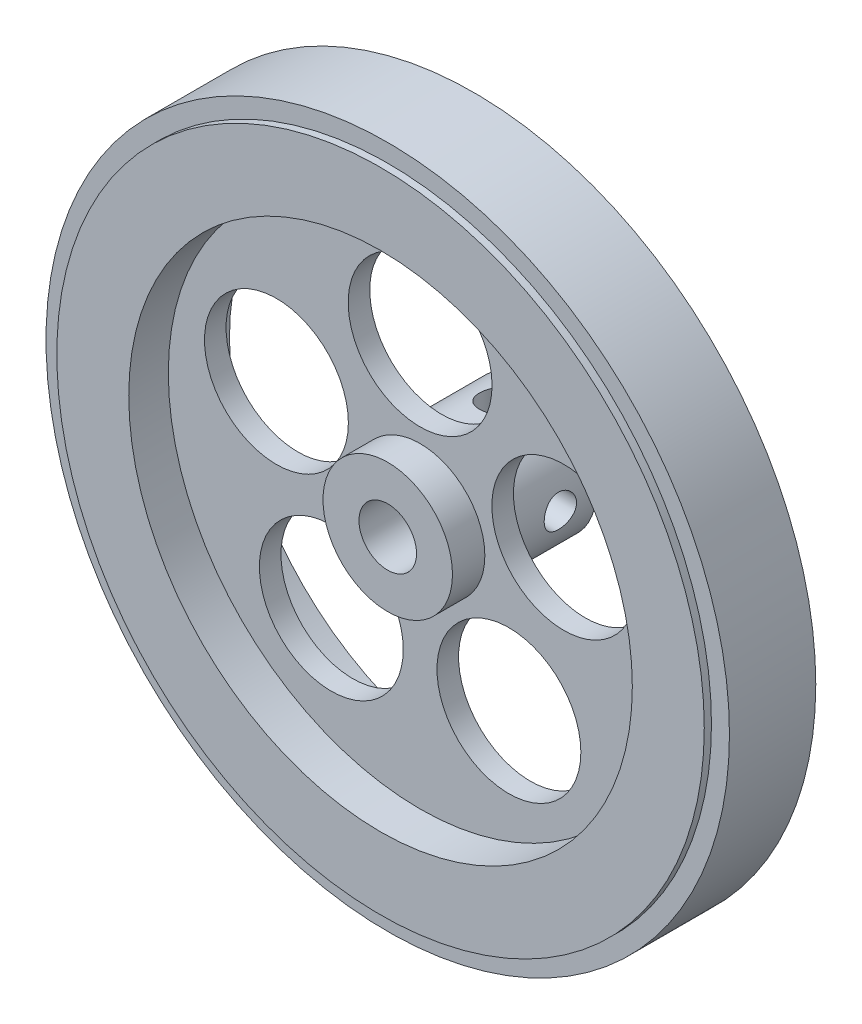
ISO-10303-21;
HEADER;
FILE_DESCRIPTION(('STEP AP214'),'2;1');
FILE_NAME('part.step','',(''),(''),'','','');
FILE_SCHEMA(('AUTOMOTIVE_DESIGN { 1 0 10303 214 1 1 1 1 }'));
ENDSEC;
DATA;
#1=APPLICATION_CONTEXT('core data for automotive mechanical design processes');
#2=APPLICATION_PROTOCOL_DEFINITION('international standard','automotive_design',2000,#1);
#3=PRODUCT_CONTEXT('',#1,'mechanical');
#4=PRODUCT('Part','Part','',(#3));
#5=PRODUCT_RELATED_PRODUCT_CATEGORY('part','',(#4));
#6=PRODUCT_DEFINITION_FORMATION('','',#4);
#7=PRODUCT_DEFINITION_CONTEXT('part definition',#1,'design');
#8=PRODUCT_DEFINITION('design','',#6,#7);
#9=PRODUCT_DEFINITION_SHAPE('','',#8);
#10=(LENGTH_UNIT() NAMED_UNIT(*) SI_UNIT(.MILLI.,.METRE.));
#11=(NAMED_UNIT(*) PLANE_ANGLE_UNIT() SI_UNIT($,.RADIAN.));
#12=(NAMED_UNIT(*) SI_UNIT($,.STERADIAN.) SOLID_ANGLE_UNIT());
#13=UNCERTAINTY_MEASURE_WITH_UNIT(LENGTH_MEASURE(1.E-05),#10,'distance_accuracy_value','');
#14=(GEOMETRIC_REPRESENTATION_CONTEXT(3) GLOBAL_UNCERTAINTY_ASSIGNED_CONTEXT((#13)) GLOBAL_UNIT_ASSIGNED_CONTEXT((#10,
#11,#12)) REPRESENTATION_CONTEXT('',''));
#15=CARTESIAN_POINT('',(0.,0.,0.));
#16=DIRECTION('',(0.,0.,1.));
#17=DIRECTION('',(1.,0.,0.));
#18=AXIS2_PLACEMENT_3D('',#15,#16,#17);
#19=CARTESIAN_POINT('',(0.,0.,12.5));
#20=DIRECTION('',(0.,0.,1.));
#21=DIRECTION('',(1.,0.,0.));
#22=AXIS2_PLACEMENT_3D('',#19,#20,#21);
#23=CYLINDRICAL_SURFACE('',#22,45.);
#24=CARTESIAN_POINT('',(0.,0.,7.));
#25=DIRECTION('',(0.,0.,1.));
#26=DIRECTION('',(1.,0.,0.));
#27=AXIS2_PLACEMENT_3D('',#24,#25,#26);
#28=CIRCLE('',#27,45.);
#29=CARTESIAN_POINT('',(45.,0.,7.));
#30=VERTEX_POINT('',#29);
#31=EDGE_CURVE('E125',#30,#30,#28,.T.);
#32=ORIENTED_EDGE('',*,*,#31,.T.);
#33=EDGE_LOOP('',(#32));
#34=FACE_BOUND('',#33,.T.);
#35=CARTESIAN_POINT('',(0.,0.,8.));
#36=DIRECTION('',(0.,0.,1.));
#37=DIRECTION('',(1.,0.,0.));
#38=AXIS2_PLACEMENT_3D('',#35,#36,#37);
#39=CIRCLE('',#38,45.);
#40=CARTESIAN_POINT('',(45.,0.,8.));
#41=VERTEX_POINT('',#40);
#42=EDGE_CURVE('E105',#41,#41,#39,.T.);
#43=ORIENTED_EDGE('',*,*,#42,.F.);
#44=EDGE_LOOP('',(#43));
#45=FACE_BOUND('',#44,.T.);
#46=ADVANCED_FACE('F41',(#34,#45),#23,.T.);
#47=CARTESIAN_POINT('',(0.,0.,12.5));
#48=DIRECTION('',(0.,0.,1.));
#49=DIRECTION('',(1.,0.,0.));
#50=AXIS2_PLACEMENT_3D('',#47,#48,#49);
#51=PLANE('',#50);
#52=CARTESIAN_POINT('',(0.,0.,12.5));
#53=DIRECTION('',(0.,0.,1.));
#54=DIRECTION('',(1.,0.,0.));
#55=AXIS2_PLACEMENT_3D('',#52,#53,#54);
#56=CIRCLE('',#55,9.);
#57=CARTESIAN_POINT('',(9.,0.,12.5));
#58=VERTEX_POINT('',#57);
#59=EDGE_CURVE('E62',#58,#58,#56,.T.);
#60=ORIENTED_EDGE('',*,*,#59,.T.);
#61=EDGE_LOOP('',(#60));
#62=FACE_BOUND('',#61,.T.);
#63=CARTESIAN_POINT('',(0.,21.,12.5));
#64=DIRECTION('',(0.,0.,1.));
#65=DIRECTION('',(1.,0.,0.));
#66=AXIS2_PLACEMENT_3D('',#63,#64,#65);
#67=CIRCLE('',#66,10.);
#68=CARTESIAN_POINT('',(10.,21.,12.5));
#69=VERTEX_POINT('',#68);
#70=EDGE_CURVE('E149',#69,#69,#67,.T.);
#71=ORIENTED_EDGE('',*,*,#70,.T.);
#72=EDGE_LOOP('',(#71));
#73=FACE_BOUND('',#72,.T.);
#74=CARTESIAN_POINT('',(19.9721868421987,6.48935688187449,12.5));
#75=DIRECTION('',(0.,0.,1.));
#76=DIRECTION('',(1.,0.,0.));
#77=AXIS2_PLACEMENT_3D('',#74,#75,#76);
#78=CIRCLE('',#77,10.);
#79=CARTESIAN_POINT('',(29.9721868421987,6.48935688187449,12.5));
#80=VERTEX_POINT('',#79);
#81=EDGE_CURVE('E153',#80,#80,#78,.T.);
#82=ORIENTED_EDGE('',*,*,#81,.T.);
#83=EDGE_LOOP('',(#82));
#84=FACE_BOUND('',#83,.T.);
#85=CARTESIAN_POINT('',(12.3434902981431,-16.9893568818735,12.5));
#86=DIRECTION('',(0.,0.,1.));
#87=DIRECTION('',(1.,0.,0.));
#88=AXIS2_PLACEMENT_3D('',#85,#86,#87);
#89=CIRCLE('',#88,10.);
#90=CARTESIAN_POINT('',(22.3434902981431,-16.9893568818735,12.5));
#91=VERTEX_POINT('',#90);
#92=EDGE_CURVE('E157',#91,#91,#89,.T.);
#93=ORIENTED_EDGE('',*,*,#92,.T.);
#94=EDGE_LOOP('',(#93));
#95=FACE_BOUND('',#94,.T.);
#96=CARTESIAN_POINT('',(-12.3434902981408,-16.9893568818743,12.5));
#97=DIRECTION('',(0.,0.,1.));
#98=DIRECTION('',(1.,0.,0.));
#99=AXIS2_PLACEMENT_3D('',#96,#97,#98);
#100=CIRCLE('',#99,10.);
#101=CARTESIAN_POINT('',(-2.34349029814081,-16.9893568818743,12.5));
#102=VERTEX_POINT('',#101);
#103=EDGE_CURVE('E161',#102,#102,#100,.T.);
#104=ORIENTED_EDGE('',*,*,#103,.T.);
#105=EDGE_LOOP('',(#104));
#106=FACE_BOUND('',#105,.T.);
#107=CARTESIAN_POINT('',(-19.9721868421978,6.4893568818733,12.5));
#108=DIRECTION('',(0.,0.,1.));
#109=DIRECTION('',(1.,0.,0.));
#110=AXIS2_PLACEMENT_3D('',#107,#108,#109);
#111=CIRCLE('',#110,10.);
#112=CARTESIAN_POINT('',(-9.9721868421978,6.4893568818733,12.5));
#113=VERTEX_POINT('',#112);
#114=EDGE_CURVE('E165',#113,#113,#111,.T.);
#115=ORIENTED_EDGE('',*,*,#114,.T.);
#116=EDGE_LOOP('',(#115));
#117=FACE_BOUND('',#116,.T.);
#118=CARTESIAN_POINT('',(0.,0.,12.5));
#119=DIRECTION('',(0.,0.,1.));
#120=DIRECTION('',(1.,0.,0.));
#121=AXIS2_PLACEMENT_3D('',#118,#119,#120);
#122=CIRCLE('',#121,35.);
#123=CARTESIAN_POINT('',(35.,0.,12.5));
#124=VERTEX_POINT('',#123);
#125=EDGE_CURVE('E56',#124,#124,#122,.T.);
#126=ORIENTED_EDGE('',*,*,#125,.F.);
#127=EDGE_LOOP('',(#126));
#128=FACE_BOUND('',#127,.T.);
#129=ADVANCED_FACE('F215',(#62,#73,#84,#95,#106,#117,#128),#51,.F.);
#130=CARTESIAN_POINT('',(0.,0.,15.5));
#131=DIRECTION('',(0.,0.,1.));
#132=DIRECTION('',(1.,0.,0.));
#133=AXIS2_PLACEMENT_3D('',#130,#131,#132);
#134=PLANE('',#133);
#135=CARTESIAN_POINT('',(0.,0.,15.5));
#136=DIRECTION('',(0.,0.,1.));
#137=DIRECTION('',(1.,0.,0.));
#138=AXIS2_PLACEMENT_3D('',#135,#136,#137);
#139=CIRCLE('',#138,9.);
#140=CARTESIAN_POINT('',(9.,0.,15.5));
#141=VERTEX_POINT('',#140);
#142=EDGE_CURVE('E169',#141,#141,#139,.T.);
#143=ORIENTED_EDGE('',*,*,#142,.F.);
#144=EDGE_LOOP('',(#143));
#145=FACE_BOUND('',#144,.T.);
#146=CARTESIAN_POINT('',(0.,21.,15.5));
#147=DIRECTION('',(0.,0.,1.));
#148=DIRECTION('',(1.,0.,0.));
#149=AXIS2_PLACEMENT_3D('',#146,#147,#148);
#150=CIRCLE('',#149,10.);
#151=CARTESIAN_POINT('',(10.,21.,15.5));
#152=VERTEX_POINT('',#151);
#153=EDGE_CURVE('E133',#152,#152,#150,.T.);
#154=ORIENTED_EDGE('',*,*,#153,.F.);
#155=EDGE_LOOP('',(#154));
#156=FACE_BOUND('',#155,.T.);
#157=CARTESIAN_POINT('',(19.9721868421987,6.48935688187449,15.5));
#158=DIRECTION('',(0.,0.,1.));
#159=DIRECTION('',(1.,0.,0.));
#160=AXIS2_PLACEMENT_3D('',#157,#158,#159);
#161=CIRCLE('',#160,10.);
#162=CARTESIAN_POINT('',(29.9721868421987,6.48935688187449,15.5));
#163=VERTEX_POINT('',#162);
#164=EDGE_CURVE('E129',#163,#163,#161,.T.);
#165=ORIENTED_EDGE('',*,*,#164,.F.);
#166=EDGE_LOOP('',(#165));
#167=FACE_BOUND('',#166,.T.);
#168=CARTESIAN_POINT('',(12.3434902981431,-16.9893568818735,15.5));
#169=DIRECTION('',(0.,0.,1.));
#170=DIRECTION('',(1.,0.,0.));
#171=AXIS2_PLACEMENT_3D('',#168,#169,#170);
#172=CIRCLE('',#171,10.);
#173=CARTESIAN_POINT('',(22.3434902981431,-16.9893568818735,15.5));
#174=VERTEX_POINT('',#173);
#175=EDGE_CURVE('E134',#174,#174,#172,.T.);
#176=ORIENTED_EDGE('',*,*,#175,.F.);
#177=EDGE_LOOP('',(#176));
#178=FACE_BOUND('',#177,.T.);
#179=CARTESIAN_POINT('',(-12.3434902981408,-16.9893568818743,15.5));
#180=DIRECTION('',(0.,0.,1.));
#181=DIRECTION('',(1.,0.,0.));
#182=AXIS2_PLACEMENT_3D('',#179,#180,#181);
#183=CIRCLE('',#182,10.);
#184=CARTESIAN_POINT('',(-2.34349029814081,-16.9893568818743,15.5));
#185=VERTEX_POINT('',#184);
#186=EDGE_CURVE('E138',#185,#185,#183,.T.);
#187=ORIENTED_EDGE('',*,*,#186,.F.);
#188=EDGE_LOOP('',(#187));
#189=FACE_BOUND('',#188,.T.);
#190=CARTESIAN_POINT('',(-19.9721868421978,6.4893568818733,15.5));
#191=DIRECTION('',(0.,0.,1.));
#192=DIRECTION('',(1.,0.,0.));
#193=AXIS2_PLACEMENT_3D('',#190,#191,#192);
#194=CIRCLE('',#193,10.);
#195=CARTESIAN_POINT('',(-9.9721868421978,6.4893568818733,15.5));
#196=VERTEX_POINT('',#195);
#197=EDGE_CURVE('E142',#196,#196,#194,.T.);
#198=ORIENTED_EDGE('',*,*,#197,.F.);
#199=EDGE_LOOP('',(#198));
#200=FACE_BOUND('',#199,.T.);
#201=CARTESIAN_POINT('',(0.,0.,15.5));
#202=DIRECTION('',(0.,0.,1.));
#203=DIRECTION('',(1.,0.,0.));
#204=AXIS2_PLACEMENT_3D('',#201,#202,#203);
#205=CIRCLE('',#204,35.);
#206=CARTESIAN_POINT('',(35.,0.,15.5));
#207=VERTEX_POINT('',#206);
#208=EDGE_CURVE('E65',#207,#207,#205,.T.);
#209=ORIENTED_EDGE('',*,*,#208,.T.);
#210=EDGE_LOOP('',(#209));
#211=FACE_BOUND('',#210,.T.);
#212=ADVANCED_FACE('F221',(#145,#156,#167,#178,#189,#200,#211),#134,.T.);
#213=CARTESIAN_POINT('',(0.,0.,20.));
#214=DIRECTION('',(0.,0.,-1.));
#215=DIRECTION('',(-1.,0.,0.));
#216=AXIS2_PLACEMENT_3D('',#213,#214,#215);
#217=CYLINDRICAL_SURFACE('',#216,9.);
#218=CARTESIAN_POINT('',(9.,0.,7.24999999999999));
#219=CARTESIAN_POINT('',(8.99999789802018,0.124314133004596,7.24999651139275));
#220=CARTESIAN_POINT('',(8.99739867197739,0.248667236746143,7.23966267383931));
#221=CARTESIAN_POINT('',(8.98728170744841,0.493809485655796,7.19866227303948));
#222=CARTESIAN_POINT('',(8.97976118129964,0.614596570306106,7.16798418569321));
#223=CARTESIAN_POINT('',(8.96063439498048,0.849031308273861,7.08734111980686));
#224=CARTESIAN_POINT('',(8.94903304263087,0.962687345144999,7.03739930192709));
#225=CARTESIAN_POINT('',(8.92298015711432,1.18000819785664,6.91972791493273));
#226=CARTESIAN_POINT('',(8.90852852781235,1.28367267652314,6.85199774582154));
#227=CARTESIAN_POINT('',(8.8780112038754,1.48020289095137,6.69919881551872));
#228=CARTESIAN_POINT('',(8.86192060722189,1.57283353509158,6.6138326375614));
#229=CARTESIAN_POINT('',(8.83010430176904,1.74262339080497,6.42882169263644));
#230=CARTESIAN_POINT('',(8.81437863434801,1.81978085542378,6.32917531557959));
#231=CARTESIAN_POINT('',(8.78482163547253,1.95753981419845,6.11660715989451));
#232=CARTESIAN_POINT('',(8.77102191697217,2.0178783238877,6.0035101537869));
#233=CARTESIAN_POINT('',(8.74724242227025,2.1185953628261,5.76837738250994));
#234=CARTESIAN_POINT('',(8.73726203541628,2.1589770831602,5.64634305000197));
#235=CARTESIAN_POINT('',(8.72250715044484,2.21783225520714,5.39938475269751));
#236=CARTESIAN_POINT('',(8.71763236495517,2.23672840249807,5.27456765594301));
#237=CARTESIAN_POINT('',(8.71334043689387,2.2533926625996,5.02344714650098));
#238=CARTESIAN_POINT('',(8.71392240641893,2.25116421272715,4.89714397896179));
#239=CARTESIAN_POINT('',(8.72038808275225,2.22597978695955,4.64987628838197));
#240=CARTESIAN_POINT('',(8.72614294510941,2.20352751028594,4.52885656780201));
#241=CARTESIAN_POINT('',(8.74210064506604,2.13933628035448,4.29235842363341));
#242=CARTESIAN_POINT('',(8.75230379953858,2.09759595310408,4.17688039545662));
#243=CARTESIAN_POINT('',(8.77612670858489,1.99558421690577,3.95339297562181));
#244=CARTESIAN_POINT('',(8.78977991204724,1.93513000084937,3.84547074231565));
#245=CARTESIAN_POINT('',(8.81894566268987,1.79753441402241,3.64112193536478));
#246=CARTESIAN_POINT('',(8.83445853501942,1.72039012321325,3.54469737789913));
#247=CARTESIAN_POINT('',(8.86613820809837,1.54899513702182,3.3631945764584));
#248=CARTESIAN_POINT('',(8.88231104217001,1.45431938724878,3.27851826490798));
#249=CARTESIAN_POINT('',(8.91308948368134,1.25191787625554,3.12616813630415));
#250=CARTESIAN_POINT('',(8.92769504324111,1.14419171656191,3.05849483860466));
#251=CARTESIAN_POINT('',(8.95376598141286,0.918173833022081,2.94192412066343));
#252=CARTESIAN_POINT('',(8.96522040191591,0.799847089812929,2.89309198961837));
#253=CARTESIAN_POINT('',(8.98361875487124,0.556314012214319,2.81612404143565));
#254=CARTESIAN_POINT('',(8.9905635500892,0.431108998725723,2.7879842653728));
#255=CARTESIAN_POINT('',(8.99903248907063,0.180809955585037,2.75381365166176));
#256=CARTESIAN_POINT('',(9.00069080262418,0.055795079982312,2.74723546088706));
#257=CARTESIAN_POINT('',(8.99878207221676,-0.193549312202263,2.75487350308324));
#258=CARTESIAN_POINT('',(8.9952154986277,-0.317878889466893,2.76908786419871));
#259=CARTESIAN_POINT('',(8.98334371691035,-0.560421403164737,2.81745636258708));
#260=CARTESIAN_POINT('',(8.97510951278717,-0.67869767845313,2.85131189521549));
#261=CARTESIAN_POINT('',(8.95483059951201,-0.907885938678764,2.93766062604268));
#262=CARTESIAN_POINT('',(8.94278550554838,-1.01879717854895,2.99015570646977));
#263=CARTESIAN_POINT('',(8.91589961889466,-1.23228470164477,3.1133541933121));
#264=CARTESIAN_POINT('',(8.90101301050398,-1.33467816275374,3.18436416859516));
#265=CARTESIAN_POINT('',(8.87016763781129,-1.52628992046486,3.34218486319547));
#266=CARTESIAN_POINT('',(8.85420868877557,-1.6155059384595,3.42899830942537));
#267=CARTESIAN_POINT('',(8.82253435441157,-1.78048585210909,3.61850294126671));
#268=CARTESIAN_POINT('',(8.80683456280922,-1.85586580143304,3.72153155450364));
#269=CARTESIAN_POINT('',(8.77789317565858,-1.98826613851904,3.93909895169858));
#270=CARTESIAN_POINT('',(8.76465147100539,-2.04528734123689,4.05363722443964));
#271=CARTESIAN_POINT('',(8.74227142101998,-2.13892713091393,4.29035858361962));
#272=CARTESIAN_POINT('',(8.73310882937859,-2.17566659498109,4.41249144251602));
#273=CARTESIAN_POINT('',(8.71990116135276,-2.22801848993066,4.66146445683367));
#274=CARTESIAN_POINT('',(8.71585496579904,-2.24363554121797,4.78830357654874));
#275=CARTESIAN_POINT('',(8.71342351805935,-2.25305788550098,5.03918153578281));
#276=CARTESIAN_POINT('',(8.71487899092396,-2.24747684667016,5.1631961526871));
#277=CARTESIAN_POINT('',(8.72291863511764,-2.21606591746929,5.40845583300197));
#278=CARTESIAN_POINT('',(8.72950270337785,-2.19023643403014,5.52970095202047));
#279=CARTESIAN_POINT('',(8.74696891024084,-2.11939697916418,5.76531268859811));
#280=CARTESIAN_POINT('',(8.75782522854464,-2.07450210702055,5.87971595786031));
#281=CARTESIAN_POINT('',(8.78261633587243,-1.96689737040759,6.09944807407053));
#282=CARTESIAN_POINT('',(8.7965515518116,-1.90418503505127,6.20477565978037));
#283=CARTESIAN_POINT('',(8.82638451395268,-1.76080162295569,6.40633194350302));
#284=CARTESIAN_POINT('',(8.84232397247636,-1.67970474436837,6.50225161013593));
#285=CARTESIAN_POINT('',(8.87412040869429,-1.50268405678459,6.6793205671931));
#286=CARTESIAN_POINT('',(8.88997736590589,-1.40675673189171,6.76046634516945));
#287=CARTESIAN_POINT('',(8.92016483471494,-1.20070138005388,6.9071169628469));
#288=CARTESIAN_POINT('',(8.93446250048802,-1.09034763347457,6.97231192050736));
#289=CARTESIAN_POINT('',(8.95957387462678,-0.859899089265707,7.08312119441078));
#290=CARTESIAN_POINT('',(8.97039007799672,-0.739811345155103,7.12874954097279));
#291=CARTESIAN_POINT('',(8.98572089348312,-0.516615379865203,7.19235774549447));
#292=CARTESIAN_POINT('',(8.99103877579036,-0.414570256362099,7.21392686458014));
#293=CARTESIAN_POINT('',(8.99817907847923,-0.208359107304423,7.2427489154329));
#294=CARTESIAN_POINT('',(9.00000176176341,-0.104193241863924,7.25000292395794));
#295=CARTESIAN_POINT('',(9.,0.,7.24999999999999));
#296=B_SPLINE_CURVE_WITH_KNOTS('',3,(#218,#219,#220,#221,#222,#223,#224,#225,#226,#227,#228,
#229,#230,#231,#232,#233,#234,#235,#236,#237,#238,#239,#240,#241,#242,#243,#244,#245,#246,#247,
#248,#249,#250,#251,#252,#253,#254,#255,#256,#257,#258,#259,#260,#261,#262,#263,#264,#265,#266,
#267,#268,#269,#270,#271,#272,#273,#274,#275,#276,#277,#278,#279,#280,#281,#282,#283,#284,#285,
#286,#287,#288,#289,#290,#291,#292,#293,#294,#295),.UNSPECIFIED.,.T.,.F.,(4,2,2,2,2,2,2,2,2,2,2,
2,2,2,2,2,2,2,2,2,2,2,2,2,2,2,2,2,2,2,2,2,2,2,2,2,2,2,4),(0.,0.372560568707833,
0.745332356645846,1.11765735342915,1.48999491025398,1.86921653155708,2.24848094370092,
2.63337971318709,3.01821691754051,3.39534442651603,3.77241057174024,4.14033745515506,
4.50829055204036,4.87995791815797,5.25169036259222,5.63402251458507,6.01636634342349,
6.40002343518649,6.78360710537942,7.15737463428892,7.53110851674091,7.89930411776033,
8.26753690988412,8.64230381353004,9.01713544517005,9.4011676381169,9.78518278129238,
10.1668838192603,10.5485013488359,10.9191567060289,11.2898046143903,11.6582460084415,
12.0267385221033,12.4048436461984,12.783038546606,13.1680827825436,13.55285045737,
13.865133644182,14.1773933406953),.UNSPECIFIED.);
#297=CARTESIAN_POINT('',(9.,0.,7.24999999999999));
#298=VERTEX_POINT('',#297);
#299=EDGE_CURVE('E75',#298,#298,#296,.T.);
#300=ORIENTED_EDGE('',*,*,#299,.T.);
#301=EDGE_LOOP('',(#300));
#302=FACE_BOUND('',#301,.T.);
#303=CARTESIAN_POINT('',(0.,9.,2.75000000000001));
#304=CARTESIAN_POINT('',(0.124314133004596,8.99999789802018,2.75000348860725));
#305=CARTESIAN_POINT('',(0.248667236746144,8.99739867197739,2.76033732616069));
#306=CARTESIAN_POINT('',(0.493809485655797,8.98728170744841,2.80133772696052));
#307=CARTESIAN_POINT('',(0.614596570306106,8.97976118129964,2.83201581430678));
#308=CARTESIAN_POINT('',(0.849031308273862,8.96063439498048,2.91265888019314));
#309=CARTESIAN_POINT('',(0.962687345144999,8.94903304263087,2.96260069807291));
#310=CARTESIAN_POINT('',(1.18000819785664,8.92298015711432,3.08027208506727));
#311=CARTESIAN_POINT('',(1.28367267652314,8.90852852781235,3.14800225417846));
#312=CARTESIAN_POINT('',(1.48020289095137,8.8780112038754,3.30080118448128));
#313=CARTESIAN_POINT('',(1.57283353509158,8.86192060722189,3.3861673624386));
#314=CARTESIAN_POINT('',(1.74262339080497,8.83010430176905,3.57117830736356));
#315=CARTESIAN_POINT('',(1.81978085542378,8.81437863434801,3.67082468442041));
#316=CARTESIAN_POINT('',(1.95753981419845,8.78482163547253,3.88339284010549));
#317=CARTESIAN_POINT('',(2.0178783238877,8.77102191697216,3.9964898462131));
#318=CARTESIAN_POINT('',(2.11859536282611,8.74724242227025,4.23162261749006));
#319=CARTESIAN_POINT('',(2.1589770831602,8.73726203541628,4.35365694999803));
#320=CARTESIAN_POINT('',(2.21783225520714,8.72250715044484,4.60061524730249));
#321=CARTESIAN_POINT('',(2.23672840249807,8.71763236495517,4.72543234405699));
#322=CARTESIAN_POINT('',(2.2533926625996,8.71334043689387,4.97655285349902));
#323=CARTESIAN_POINT('',(2.25116421272716,8.71392240641893,5.1028560210382));
#324=CARTESIAN_POINT('',(2.22597978695955,8.72038808275225,5.35012371161803));
#325=CARTESIAN_POINT('',(2.20352751028594,8.72614294510941,5.47114343219799));
#326=CARTESIAN_POINT('',(2.13933628035448,8.74210064506604,5.70764157636659));
#327=CARTESIAN_POINT('',(2.09759595310408,8.75230379953858,5.82311960454338));
#328=CARTESIAN_POINT('',(1.99558421690577,8.77612670858489,6.04660702437819));
#329=CARTESIAN_POINT('',(1.93513000084937,8.78977991204724,6.15452925768435));
#330=CARTESIAN_POINT('',(1.79753441402241,8.81894566268987,6.35887806463523));
#331=CARTESIAN_POINT('',(1.72039012321325,8.83445853501942,6.45530262210087));
#332=CARTESIAN_POINT('',(1.54899513702182,8.86613820809837,6.6368054235416));
#333=CARTESIAN_POINT('',(1.45431938724878,8.88231104217001,6.72148173509202));
#334=CARTESIAN_POINT('',(1.25191787625554,8.91308948368134,6.87383186369585));
#335=CARTESIAN_POINT('',(1.14419171656191,8.92769504324111,6.94150516139534));
#336=CARTESIAN_POINT('',(0.918173833022083,8.95376598141286,7.05807587933657));
#337=CARTESIAN_POINT('',(0.799847089812931,8.96522040191591,7.10690801038163));
#338=CARTESIAN_POINT('',(0.556314012214321,8.98361875487124,7.18387595856435));
#339=CARTESIAN_POINT('',(0.431108998725724,8.9905635500892,7.2120157346272));
#340=CARTESIAN_POINT('',(0.180809955585039,8.99903248907063,7.24618634833825));
#341=CARTESIAN_POINT('',(0.0557950799823134,9.00069080262418,7.25276453911294));
#342=CARTESIAN_POINT('',(-0.193549312202262,8.99878207221676,7.24512649691676));
#343=CARTESIAN_POINT('',(-0.317878889466892,8.9952154986277,7.23091213580129));
#344=CARTESIAN_POINT('',(-0.560421403164736,8.98334371691035,7.18254363741292));
#345=CARTESIAN_POINT('',(-0.678697678453129,8.97510951278717,7.14868810478451));
#346=CARTESIAN_POINT('',(-0.907885938678764,8.95483059951201,7.06233937395732));
#347=CARTESIAN_POINT('',(-1.01879717854895,8.94278550554838,7.00984429353024));
#348=CARTESIAN_POINT('',(-1.23228470164477,8.91589961889466,6.8866458066879));
#349=CARTESIAN_POINT('',(-1.33467816275374,8.90101301050398,6.81563583140485));
#350=CARTESIAN_POINT('',(-1.52628992046486,8.87016763781129,6.65781513680454));
#351=CARTESIAN_POINT('',(-1.61550593845951,8.85420868877557,6.57100169057463));
#352=CARTESIAN_POINT('',(-1.78048585210909,8.82253435441157,6.3814970587333));
#353=CARTESIAN_POINT('',(-1.85586580143304,8.80683456280922,6.27846844549636));
#354=CARTESIAN_POINT('',(-1.98826613851904,8.77789317565858,6.06090104830142));
#355=CARTESIAN_POINT('',(-2.0452873412369,8.76465147100539,5.94636277556036));
#356=CARTESIAN_POINT('',(-2.13892713091393,8.74227142101998,5.70964141638038));
#357=CARTESIAN_POINT('',(-2.17566659498109,8.73310882937859,5.58750855748398));
#358=CARTESIAN_POINT('',(-2.22801848993066,8.71990116135276,5.33853554316633));
#359=CARTESIAN_POINT('',(-2.24363554121798,8.71585496579904,5.21169642345126));
#360=CARTESIAN_POINT('',(-2.25305788550098,8.71342351805935,4.9608184642172));
#361=CARTESIAN_POINT('',(-2.24747684667017,8.71487899092396,4.8368038473129));
#362=CARTESIAN_POINT('',(-2.21606591746929,8.72291863511764,4.59154416699803));
#363=CARTESIAN_POINT('',(-2.19023643403014,8.72950270337785,4.47029904797952));
#364=CARTESIAN_POINT('',(-2.11939697916418,8.74696891024084,4.23468731140189));
#365=CARTESIAN_POINT('',(-2.07450210702055,8.75782522854464,4.12028404213969));
#366=CARTESIAN_POINT('',(-1.9668973704076,8.78261633587243,3.90055192592947));
#367=CARTESIAN_POINT('',(-1.90418503505127,8.79655155181159,3.79522434021963));
#368=CARTESIAN_POINT('',(-1.7608016229557,8.82638451395268,3.59366805649697));
#369=CARTESIAN_POINT('',(-1.67970474436837,8.84232397247636,3.49774838986407));
#370=CARTESIAN_POINT('',(-1.50268405678459,8.87412040869429,3.32067943280689));
#371=CARTESIAN_POINT('',(-1.40675673189171,8.88997736590589,3.23953365483055));
#372=CARTESIAN_POINT('',(-1.20070138005388,8.92016483471494,3.0928830371531));
#373=CARTESIAN_POINT('',(-1.09034763347457,8.93446250048802,3.02768807949264));
#374=CARTESIAN_POINT('',(-0.859899089265708,8.95957387462678,2.91687880558921));
#375=CARTESIAN_POINT('',(-0.739811345155104,8.97039007799672,2.8712504590272));
#376=CARTESIAN_POINT('',(-0.516615379865203,8.98572089348312,2.80764225450553));
#377=CARTESIAN_POINT('',(-0.414570256362099,8.99103877579036,2.78607313541986));
#378=CARTESIAN_POINT('',(-0.208359107304423,8.99817907847923,2.7572510845671));
#379=CARTESIAN_POINT('',(-0.104193241863924,9.00000176176341,2.74999707604206));
#380=CARTESIAN_POINT('',(0.,9.,2.75000000000001));
#381=B_SPLINE_CURVE_WITH_KNOTS('',3,(#303,#304,#305,#306,#307,#308,#309,#310,#311,#312,#313,
#314,#315,#316,#317,#318,#319,#320,#321,#322,#323,#324,#325,#326,#327,#328,#329,#330,#331,#332,
#333,#334,#335,#336,#337,#338,#339,#340,#341,#342,#343,#344,#345,#346,#347,#348,#349,#350,#351,
#352,#353,#354,#355,#356,#357,#358,#359,#360,#361,#362,#363,#364,#365,#366,#367,#368,#369,#370,
#371,#372,#373,#374,#375,#376,#377,#378,#379,#380),.UNSPECIFIED.,.T.,.F.,(4,2,2,2,2,2,2,2,2,2,2,
2,2,2,2,2,2,2,2,2,2,2,2,2,2,2,2,2,2,2,2,2,2,2,2,2,2,2,4),(0.,0.372560568707833,
0.745332356645846,1.11765735342915,1.48999491025399,1.86921653155708,2.24848094370092,
2.63337971318709,3.01821691754051,3.39534442651603,3.77241057174025,4.14033745515506,
4.50829055204037,4.87995791815798,5.25169036259223,5.63402251458508,6.01636634342349,
6.40002343518649,6.78360710537942,7.15737463428892,7.53110851674092,7.89930411776034,
8.26753690988413,8.64230381353005,9.01713544517006,9.40116763811691,9.78518278129239,
10.1668838192603,10.5485013488359,10.919156706029,11.2898046143903,11.6582460084415,
12.0267385221033,12.4048436461984,12.783038546606,13.1680827825436,13.55285045737,
13.865133644182,14.1773933406953),.UNSPECIFIED.);
#382=CARTESIAN_POINT('',(0.,9.,2.75000000000001));
#383=VERTEX_POINT('',#382);
#384=EDGE_CURVE('E74',#383,#383,#381,.T.);
#385=ORIENTED_EDGE('',*,*,#384,.T.);
#386=EDGE_LOOP('',(#385));
#387=FACE_BOUND('',#386,.T.);
#388=CARTESIAN_POINT('',(0.,0.,0.));
#389=DIRECTION('',(0.,0.,1.));
#390=DIRECTION('',(1.,0.,0.));
#391=AXIS2_PLACEMENT_3D('',#388,#389,#390);
#392=CIRCLE('',#391,9.);
#393=CARTESIAN_POINT('',(9.,0.,0.));
#394=VERTEX_POINT('',#393);
#395=EDGE_CURVE('E182',#394,#394,#392,.T.);
#396=ORIENTED_EDGE('',*,*,#395,.T.);
#397=EDGE_LOOP('',(#396));
#398=FACE_BOUND('',#397,.T.);
#399=ORIENTED_EDGE('',*,*,#59,.F.);
#400=EDGE_LOOP('',(#399));
#401=FACE_BOUND('',#400,.T.);
#402=ADVANCED_FACE('F192',(#302,#387,#398,#401),#217,.T.);
#403=CARTESIAN_POINT('',(0.,0.,0.));
#404=DIRECTION('',(0.,0.,1.));
#405=DIRECTION('',(1.,0.,0.));
#406=AXIS2_PLACEMENT_3D('',#403,#404,#405);
#407=PLANE('',#406);
#408=ORIENTED_EDGE('',*,*,#395,.F.);
#409=EDGE_LOOP('',(#408));
#410=FACE_BOUND('',#409,.T.);
#411=CARTESIAN_POINT('',(0.,0.,0.));
#412=DIRECTION('',(0.,0.,1.));
#413=DIRECTION('',(1.,0.,0.));
#414=AXIS2_PLACEMENT_3D('',#411,#412,#413);
#415=CIRCLE('',#414,4.);
#416=CARTESIAN_POINT('',(4.,0.,0.));
#417=VERTEX_POINT('',#416);
#418=EDGE_CURVE('E173',#417,#417,#415,.T.);
#419=ORIENTED_EDGE('',*,*,#418,.T.);
#420=EDGE_LOOP('',(#419));
#421=FACE_BOUND('',#420,.T.);
#422=ADVANCED_FACE('F195',(#410,#421),#407,.F.);
#423=ORIENTED_EDGE('',*,*,#142,.T.);
#424=EDGE_LOOP('',(#423));
#425=FACE_BOUND('',#424,.T.);
#426=CARTESIAN_POINT('',(0.,0.,20.));
#427=DIRECTION('',(0.,0.,1.));
#428=DIRECTION('',(1.,0.,0.));
#429=AXIS2_PLACEMENT_3D('',#426,#427,#428);
#430=CIRCLE('',#429,9.);
#431=CARTESIAN_POINT('',(9.,0.,20.));
#432=VERTEX_POINT('',#431);
#433=EDGE_CURVE('E177',#432,#432,#430,.T.);
#434=ORIENTED_EDGE('',*,*,#433,.F.);
#435=EDGE_LOOP('',(#434));
#436=FACE_BOUND('',#435,.T.);
#437=ADVANCED_FACE('F43',(#425,#436),#217,.T.);
#438=CARTESIAN_POINT('',(0.,0.,20.));
#439=DIRECTION('',(0.,0.,1.));
#440=DIRECTION('',(1.,0.,0.));
#441=AXIS2_PLACEMENT_3D('',#438,#439,#440);
#442=PLANE('',#441);
#443=ORIENTED_EDGE('',*,*,#433,.T.);
#444=EDGE_LOOP('',(#443));
#445=FACE_BOUND('',#444,.T.);
#446=CARTESIAN_POINT('',(0.,0.,20.));
#447=DIRECTION('',(0.,0.,1.));
#448=DIRECTION('',(1.,0.,0.));
#449=AXIS2_PLACEMENT_3D('',#446,#447,#448);
#450=CIRCLE('',#449,4.);
#451=CARTESIAN_POINT('',(4.,0.,20.));
#452=VERTEX_POINT('',#451);
#453=EDGE_CURVE('E178',#452,#452,#450,.T.);
#454=ORIENTED_EDGE('',*,*,#453,.F.);
#455=EDGE_LOOP('',(#454));
#456=FACE_BOUND('',#455,.T.);
#457=ADVANCED_FACE('F202',(#445,#456),#442,.T.);
#458=CARTESIAN_POINT('',(0.,0.,20.));
#459=DIRECTION('',(0.,0.,-1.));
#460=DIRECTION('',(-1.,0.,0.));
#461=AXIS2_PLACEMENT_3D('',#458,#459,#460);
#462=CYLINDRICAL_SURFACE('',#461,4.);
#463=CARTESIAN_POINT('',(4.,0.,7.24999999999999));
#464=CARTESIAN_POINT('',(4.00000478544653,0.116574361582472,7.25000546869482));
#465=CARTESIAN_POINT('',(3.99486161015437,0.233117494271239,7.24090182102279));
#466=CARTESIAN_POINT('',(3.97483223454772,0.462569233089476,7.20499741058454));
#467=CARTESIAN_POINT('',(3.95994512022037,0.575477497214018,7.17819498761409));
#468=CARTESIAN_POINT('',(3.92194301780639,0.794135368983556,7.10831415962371));
#469=CARTESIAN_POINT('',(3.89885841586878,0.899909720053428,7.06529582739332));
#470=CARTESIAN_POINT('',(3.84647695565079,1.10253378507155,6.96461980634956));
#471=CARTESIAN_POINT('',(3.81717856353268,1.19938128699592,6.90695850230941));
#472=CARTESIAN_POINT('',(3.75249587564385,1.38906915002198,6.77407224990463));
#473=CARTESIAN_POINT('',(3.71682789510745,1.48114339668484,6.69789445327603));
#474=CARTESIAN_POINT('',(3.64413342628144,1.65194589061997,6.53223736299998));
#475=CARTESIAN_POINT('',(3.60710555491408,1.73066006559966,6.44274422803762));
#476=CARTESIAN_POINT('',(3.53132973794817,1.8808229905242,6.24190582913479));
#477=CARTESIAN_POINT('',(3.49280663301794,1.95065199991236,6.12925418247148));
#478=CARTESIAN_POINT('',(3.42338878308606,2.07007441099025,5.8915771556933));
#479=CARTESIAN_POINT('',(3.39248289010151,2.11969745487575,5.76657023804669));
#480=CARTESIAN_POINT('',(3.34873790347699,2.18797418220356,5.53527703405716));
#481=CARTESIAN_POINT('',(3.33344311646644,2.21099236506624,5.43074393716449));
#482=CARTESIAN_POINT('',(3.31272698675541,2.24191937059643,5.21854577221405));
#483=CARTESIAN_POINT('',(3.30729555624901,2.24984363106812,5.11088401867435));
#484=CARTESIAN_POINT('',(3.30708570593104,2.25015198203818,4.89540129646222));
#485=CARTESIAN_POINT('',(3.31232016010623,2.24251729249722,4.78758029253858));
#486=CARTESIAN_POINT('',(3.33269723151076,2.21211443713198,4.57503742556956));
#487=CARTESIAN_POINT('',(3.34784644914888,2.18933618985117,4.470317675652));
#488=CARTESIAN_POINT('',(3.38603292300512,2.12979203835402,4.26669723451271));
#489=CARTESIAN_POINT('',(3.40905841136274,2.09304699274244,4.16778811853689));
#490=CARTESIAN_POINT('',(3.46051165794459,2.00683191613314,3.97722052220233));
#491=CARTESIAN_POINT('',(3.48894150865606,1.95735695367261,3.88556486980739));
#492=CARTESIAN_POINT('',(3.55335821820067,1.83818085300224,3.69696704027249));
#493=CARTESIAN_POINT('',(3.58983262447658,1.76653038669176,3.60142134593013));
#494=CARTESIAN_POINT('',(3.66310576724814,1.60910062289686,3.42282407613297));
#495=CARTESIAN_POINT('',(3.69990474528988,1.52330978155465,3.33978281587373));
#496=CARTESIAN_POINT('',(3.77433344135286,1.32903508462715,3.17965851352839));
#497=CARTESIAN_POINT('',(3.81163274215656,1.21910653825672,3.10415698250827));
#498=CARTESIAN_POINT('',(3.8785102897696,0.985819808739907,2.97305066408044));
#499=CARTESIAN_POINT('',(3.90809353555846,0.862470394320818,2.91743298587281));
#500=CARTESIAN_POINT('',(3.95433282446718,0.614802935181402,2.83194877510357));
#501=CARTESIAN_POINT('',(3.97175099800325,0.491161652101943,2.80054772255608));
#502=CARTESIAN_POINT('',(3.99482968000702,0.239312439490543,2.75913610942458));
#503=CARTESIAN_POINT('',(4.0005010871484,0.111108855331863,2.74910572084725));
#504=CARTESIAN_POINT('',(3.99948985429328,-0.130040783074064,2.75090998059479));
#505=CARTESIAN_POINT('',(3.99417274413828,-0.243020002233857,2.76032772191422));
#506=CARTESIAN_POINT('',(3.97439096014101,-0.46549428237948,2.79579924786929));
#507=CARTESIAN_POINT('',(3.95992604703182,-0.574989252153746,2.82185346764337));
#508=CARTESIAN_POINT('',(3.92328872220358,-0.786967121562119,2.88919850395394));
#509=CARTESIAN_POINT('',(3.90116658018562,-0.889490661546795,2.93039005016322));
#510=CARTESIAN_POINT('',(3.85101918921102,-1.08626635912844,3.02654376176079));
#511=CARTESIAN_POINT('',(3.82299243073654,-1.18051639285429,3.08150944919658));
#512=CARTESIAN_POINT('',(3.76002936312769,-1.36857667308343,3.21008778086751));
#513=CARTESIAN_POINT('',(3.72467800248919,-1.46132919322936,3.28504251697379));
#514=CARTESIAN_POINT('',(3.65238471184595,-1.63365800644759,3.44829951594229));
#515=CARTESIAN_POINT('',(3.61544103187715,-1.71321931178773,3.53661674626745));
#516=CARTESIAN_POINT('',(3.53951439409258,-1.86542341442178,3.73511021038281));
#517=CARTESIAN_POINT('',(3.50072726004721,-1.93645169791217,3.84660945009419));
#518=CARTESIAN_POINT('',(3.43037744626153,-2.05851857364412,4.0821076922145));
#519=CARTESIAN_POINT('',(3.39880480330901,-2.10958480364701,4.206089111435));
#520=CARTESIAN_POINT('',(3.35340305197012,-2.18084463813156,4.43633213418198));
#521=CARTESIAN_POINT('',(3.33723657165908,-2.20527701624257,4.5408196245928));
#522=CARTESIAN_POINT('',(3.31471067608655,-2.23899995281605,4.75320425849524));
#523=CARTESIAN_POINT('',(3.30834087137768,-2.24830655287418,4.86109766584785));
#524=CARTESIAN_POINT('',(3.30632360585782,-2.25127274506086,5.07737044088985));
#525=CARTESIAN_POINT('',(3.31069292179552,-2.24490785502245,5.18575030458494));
#526=CARTESIAN_POINT('',(3.32953789725069,-2.21685577078292,5.39962595532585));
#527=CARTESIAN_POINT('',(3.34402001448016,-2.19515878588967,5.50511985473131));
#528=CARTESIAN_POINT('',(3.38097911212605,-2.13778330318558,5.70962848993075));
#529=CARTESIAN_POINT('',(3.40338287245248,-2.10223255881955,5.80869304492408));
#530=CARTESIAN_POINT('',(3.45375909402076,-2.01839895296498,5.99973056531098));
#531=CARTESIAN_POINT('',(3.48173366583133,-1.9701112636748,6.09170082456797));
#532=CARTESIAN_POINT('',(3.54527276452029,-1.85366513948027,6.28084662207858));
#533=CARTESIAN_POINT('',(3.58134425635897,-1.78359984700068,6.37667903678356));
#534=CARTESIAN_POINT('',(3.65407566781854,-1.62941913124428,6.55611851439529));
#535=CARTESIAN_POINT('',(3.69073604531762,-1.54529224392735,6.63971549692175));
#536=CARTESIAN_POINT('',(3.76540884250456,-1.35402146571699,6.80181850696305));
#537=CARTESIAN_POINT('',(3.80310734128129,-1.24535169109796,6.87868670227196));
#538=CARTESIAN_POINT('',(3.87110760658433,-1.01438833074297,7.01278796212307));
#539=CARTESIAN_POINT('',(3.9014132103751,-0.89210186093392,7.07003121922418));
#540=CARTESIAN_POINT('',(3.94980432815978,-0.643615229722398,7.15981754812239));
#541=CARTESIAN_POINT('',(3.9684273957593,-0.517920543452155,7.19345729785363));
#542=CARTESIAN_POINT('',(3.99351673701052,-0.261467507514431,7.23853484366511));
#543=CARTESIAN_POINT('',(3.99999463410795,-0.130714121712677,7.24999386798578));
#544=CARTESIAN_POINT('',(4.,0.,7.24999999999999));
#545=B_SPLINE_CURVE_WITH_KNOTS('',3,(#463,#464,#465,#466,#467,#468,#469,#470,#471,#472,#473,
#474,#475,#476,#477,#478,#479,#480,#481,#482,#483,#484,#485,#486,#487,#488,#489,#490,#491,#492,
#493,#494,#495,#496,#497,#498,#499,#500,#501,#502,#503,#504,#505,#506,#507,#508,#509,#510,#511,
#512,#513,#514,#515,#516,#517,#518,#519,#520,#521,#522,#523,#524,#525,#526,#527,#528,#529,#530,
#531,#532,#533,#534,#535,#536,#537,#538,#539,#540,#541,#542,#543,#544),.UNSPECIFIED.,.T.,.F.,(4,
2,2,2,2,2,2,2,2,2,2,2,2,2,2,2,2,2,2,2,2,2,2,2,2,2,2,2,2,2,2,2,2,2,2,2,2,2,2,2,4),(0.,
0.349217040261902,0.698466842902345,1.04643534535527,1.39448984197478,1.76712658025474,
2.14015341686605,2.5521761075332,2.96359216327473,3.28655752035713,3.60919237628561,
3.93221689114865,4.25545666737862,4.57821558845877,4.90109973238011,5.27422406620245,
5.64765453225213,6.0609356047262,6.47394825708696,6.85794726055585,7.24158982908578,
7.58042476019113,7.91926855411822,8.25592875611157,8.59267513010328,8.96431825134706,
9.33638077847352,9.74768136660231,10.158410468765,10.4825563002443,10.8063581350408,
11.1306661373325,11.4551814219642,11.7767724027847,12.0984854548004,12.4692322109723,
12.8402827146263,13.253186132524,13.6658747756936,14.0578250211793,14.4493999617175),.UNSPECIFIED.);
#546=CARTESIAN_POINT('',(4.,0.,7.24999999999999));
#547=VERTEX_POINT('',#546);
#548=EDGE_CURVE('E46',#547,#547,#545,.T.);
#549=ORIENTED_EDGE('',*,*,#548,.F.);
#550=EDGE_LOOP('',(#549));
#551=FACE_BOUND('',#550,.T.);
#552=CARTESIAN_POINT('',(0.,4.,2.75000000000001));
#553=CARTESIAN_POINT('',(0.116574361582472,4.00000478544653,2.74999453130518));
#554=CARTESIAN_POINT('',(0.233117494271239,3.99486161015437,2.75909817897721));
#555=CARTESIAN_POINT('',(0.462569233089476,3.97483223454772,2.79500258941546));
#556=CARTESIAN_POINT('',(0.575477497214018,3.95994512022037,2.8218050123859));
#557=CARTESIAN_POINT('',(0.794135368983556,3.92194301780639,2.89168584037628));
#558=CARTESIAN_POINT('',(0.899909720053428,3.89885841586878,2.93470417260668));
#559=CARTESIAN_POINT('',(1.10253378507155,3.84647695565079,3.03538019365044));
#560=CARTESIAN_POINT('',(1.19938128699592,3.81717856353268,3.09304149769058));
#561=CARTESIAN_POINT('',(1.38906915002198,3.75249587564385,3.22592775009536));
#562=CARTESIAN_POINT('',(1.48114339668484,3.71682789510745,3.30210554672397));
#563=CARTESIAN_POINT('',(1.65194589061997,3.64413342628144,3.46776263700002));
#564=CARTESIAN_POINT('',(1.73066006559966,3.60710555491408,3.55725577196237));
#565=CARTESIAN_POINT('',(1.88082299052421,3.53132973794817,3.7580941708652));
#566=CARTESIAN_POINT('',(1.95065199991236,3.49280663301793,3.87074581752852));
#567=CARTESIAN_POINT('',(2.07007441099025,3.42338878308606,4.10842284430669));
#568=CARTESIAN_POINT('',(2.11969745487575,3.39248289010151,4.23342976195331));
#569=CARTESIAN_POINT('',(2.18797418220357,3.34873790347699,4.46472296594284));
#570=CARTESIAN_POINT('',(2.21099236506624,3.33344311646644,4.56925606283551));
#571=CARTESIAN_POINT('',(2.24191937059643,3.31272698675541,4.78145422778595));
#572=CARTESIAN_POINT('',(2.24984363106812,3.30729555624901,4.88911598132565));
#573=CARTESIAN_POINT('',(2.25015198203818,3.30708570593103,5.10459870353778));
#574=CARTESIAN_POINT('',(2.24251729249722,3.31232016010623,5.21241970746142));
#575=CARTESIAN_POINT('',(2.21211443713199,3.33269723151076,5.42496257443044));
#576=CARTESIAN_POINT('',(2.18933618985117,3.34784644914888,5.529682324348));
#577=CARTESIAN_POINT('',(2.12979203835402,3.38603292300512,5.73330276548729));
#578=CARTESIAN_POINT('',(2.09304699274244,3.40905841136274,5.83221188146311));
#579=CARTESIAN_POINT('',(2.00683191613315,3.46051165794459,6.02277947779767));
#580=CARTESIAN_POINT('',(1.95735695367261,3.48894150865605,6.11443513019261));
#581=CARTESIAN_POINT('',(1.83818085300224,3.55335821820066,6.30303295972751));
#582=CARTESIAN_POINT('',(1.76653038669177,3.58983262447658,6.39857865406987));
#583=CARTESIAN_POINT('',(1.60910062289686,3.66310576724814,6.57717592386703));
#584=CARTESIAN_POINT('',(1.52330978155465,3.69990474528988,6.66021718412627));
#585=CARTESIAN_POINT('',(1.32903508462715,3.77433344135285,6.82034148647161));
#586=CARTESIAN_POINT('',(1.21910653825672,3.81163274215655,6.89584301749173));
#587=CARTESIAN_POINT('',(0.98581980873991,3.8785102897696,7.02694933591956));
#588=CARTESIAN_POINT('',(0.862470394320822,3.90809353555846,7.08256701412719));
#589=CARTESIAN_POINT('',(0.614802935181405,3.95433282446718,7.16805122489643));
#590=CARTESIAN_POINT('',(0.491161652101947,3.97175099800325,7.19945227744392));
#591=CARTESIAN_POINT('',(0.239312439490546,3.99482968000702,7.24086389057542));
#592=CARTESIAN_POINT('',(0.111108855331866,4.0005010871484,7.25089427915276));
#593=CARTESIAN_POINT('',(-0.130040783074062,3.99948985429328,7.24909001940521));
#594=CARTESIAN_POINT('',(-0.243020002233856,3.99417274413828,7.23967227808578));
#595=CARTESIAN_POINT('',(-0.465494282379479,3.97439096014101,7.20420075213071));
#596=CARTESIAN_POINT('',(-0.574989252153745,3.95992604703182,7.17814653235664));
#597=CARTESIAN_POINT('',(-0.786967121562118,3.92328872220358,7.11080149604606));
#598=CARTESIAN_POINT('',(-0.889490661546794,3.90116658018562,7.06960994983678));
#599=CARTESIAN_POINT('',(-1.08626635912844,3.85101918921102,6.97345623823922));
#600=CARTESIAN_POINT('',(-1.18051639285429,3.82299243073654,6.91849055080343));
#601=CARTESIAN_POINT('',(-1.36857667308343,3.76002936312769,6.78991221913249));
#602=CARTESIAN_POINT('',(-1.46132919322936,3.7246780024892,6.71495748302622));
#603=CARTESIAN_POINT('',(-1.63365800644759,3.65238471184595,6.55170048405771));
#604=CARTESIAN_POINT('',(-1.71321931178773,3.61544103187715,6.46338325373256));
#605=CARTESIAN_POINT('',(-1.86542341442178,3.53951439409258,6.2648897896172));
#606=CARTESIAN_POINT('',(-1.93645169791217,3.50072726004721,6.15339054990581));
#607=CARTESIAN_POINT('',(-2.05851857364412,3.43037744626153,5.9178923077855));
#608=CARTESIAN_POINT('',(-2.10958480364701,3.39880480330901,5.79391088856501));
#609=CARTESIAN_POINT('',(-2.18084463813156,3.35340305197012,5.56366786581802));
#610=CARTESIAN_POINT('',(-2.20527701624257,3.33723657165908,5.4591803754072));
#611=CARTESIAN_POINT('',(-2.23899995281605,3.31471067608655,5.24679574150476));
#612=CARTESIAN_POINT('',(-2.24830655287419,3.30834087137768,5.13890233415215));
#613=CARTESIAN_POINT('',(-2.25127274506087,3.30632360585781,4.92262955911015));
#614=CARTESIAN_POINT('',(-2.24490785502245,3.31069292179551,4.81424969541506));
#615=CARTESIAN_POINT('',(-2.21685577078292,3.32953789725069,4.60037404467416));
#616=CARTESIAN_POINT('',(-2.19515878588968,3.34402001448016,4.49488014526869));
#617=CARTESIAN_POINT('',(-2.13778330318558,3.38097911212604,4.29037151006926));
#618=CARTESIAN_POINT('',(-2.10223255881956,3.40338287245248,4.19130695507592));
#619=CARTESIAN_POINT('',(-2.01839895296498,3.45375909402076,4.00026943468902));
#620=CARTESIAN_POINT('',(-1.9701112636748,3.48173366583133,3.90829917543204));
#621=CARTESIAN_POINT('',(-1.85366513948028,3.54527276452029,3.71915337792142));
#622=CARTESIAN_POINT('',(-1.78359984700068,3.58134425635897,3.62332096321644));
#623=CARTESIAN_POINT('',(-1.62941913124428,3.65407566781854,3.44388148560471));
#624=CARTESIAN_POINT('',(-1.54529224392735,3.69073604531762,3.36028450307825));
#625=CARTESIAN_POINT('',(-1.35402146571699,3.76540884250456,3.19818149303695));
#626=CARTESIAN_POINT('',(-1.24535169109797,3.80310734128129,3.12131329772804));
#627=CARTESIAN_POINT('',(-1.01438833074297,3.87110760658433,2.98721203787693));
#628=CARTESIAN_POINT('',(-0.892101860933926,3.90141321037509,2.92996878077582));
#629=CARTESIAN_POINT('',(-0.643615229722403,3.94980432815978,2.84018245187761));
#630=CARTESIAN_POINT('',(-0.517920543452159,3.9684273957593,2.80654270214637));
#631=CARTESIAN_POINT('',(-0.261467507514434,3.99351673701052,2.76146515633489));
#632=CARTESIAN_POINT('',(-0.130714121712678,3.99999463410795,2.75000613201422));
#633=CARTESIAN_POINT('',(0.,4.,2.75000000000001));
#634=B_SPLINE_CURVE_WITH_KNOTS('',3,(#552,#553,#554,#555,#556,#557,#558,#559,#560,#561,#562,
#563,#564,#565,#566,#567,#568,#569,#570,#571,#572,#573,#574,#575,#576,#577,#578,#579,#580,#581,
#582,#583,#584,#585,#586,#587,#588,#589,#590,#591,#592,#593,#594,#595,#596,#597,#598,#599,#600,
#601,#602,#603,#604,#605,#606,#607,#608,#609,#610,#611,#612,#613,#614,#615,#616,#617,#618,#619,
#620,#621,#622,#623,#624,#625,#626,#627,#628,#629,#630,#631,#632,#633),.UNSPECIFIED.,.T.,.F.,(4,
2,2,2,2,2,2,2,2,2,2,2,2,2,2,2,2,2,2,2,2,2,2,2,2,2,2,2,2,2,2,2,2,2,2,2,2,2,2,2,4),(0.,
0.349217040261903,0.698466842902345,1.04643534535527,1.39448984197478,1.76712658025474,
2.14015341686605,2.5521761075332,2.96359216327473,3.28655752035713,3.60919237628561,
3.93221689114865,4.25545666737862,4.57821558845877,4.90109973238011,5.27422406620245,
5.64765453225213,6.06093560472621,6.47394825708696,6.85794726055585,7.24158982908578,
7.58042476019114,7.91926855411822,8.25592875611157,8.59267513010328,8.96431825134706,
9.33638077847352,9.74768136660232,10.158410468765,10.4825563002443,10.8063581350408,
11.1306661373325,11.4551814219642,11.7767724027847,12.0984854548004,12.4692322109723,
12.8402827146263,13.253186132524,13.6658747756936,14.0578250211793,14.4493999617175),.UNSPECIFIED.);
#635=CARTESIAN_POINT('',(0.,4.,2.75000000000001));
#636=VERTEX_POINT('',#635);
#637=EDGE_CURVE('E67',#636,#636,#634,.T.);
#638=ORIENTED_EDGE('',*,*,#637,.F.);
#639=EDGE_LOOP('',(#638));
#640=FACE_BOUND('',#639,.T.);
#641=ORIENTED_EDGE('',*,*,#453,.T.);
#642=EDGE_LOOP('',(#641));
#643=FACE_BOUND('',#642,.T.);
#644=ORIENTED_EDGE('',*,*,#418,.F.);
#645=EDGE_LOOP('',(#644));
#646=FACE_BOUND('',#645,.T.);
#647=ADVANCED_FACE('F76',(#551,#640,#643,#646),#462,.F.);
#648=CARTESIAN_POINT('',(0.,21.,0.));
#649=DIRECTION('',(0.,0.,1.));
#650=DIRECTION('',(1.,0.,0.));
#651=AXIS2_PLACEMENT_3D('',#648,#649,#650);
#652=CYLINDRICAL_SURFACE('',#651,10.);
#653=ORIENTED_EDGE('',*,*,#153,.T.);
#654=EDGE_LOOP('',(#653));
#655=FACE_BOUND('',#654,.T.);
#656=ORIENTED_EDGE('',*,*,#70,.F.);
#657=EDGE_LOOP('',(#656));
#658=FACE_BOUND('',#657,.T.);
#659=ADVANCED_FACE('F201',(#655,#658),#652,.F.);
#660=CARTESIAN_POINT('',(19.9721868421987,6.48935688187449,0.));
#661=DIRECTION('',(0.,0.,1.));
#662=DIRECTION('',(1.,0.,0.));
#663=AXIS2_PLACEMENT_3D('',#660,#661,#662);
#664=CYLINDRICAL_SURFACE('',#663,10.);
#665=ORIENTED_EDGE('',*,*,#164,.T.);
#666=EDGE_LOOP('',(#665));
#667=FACE_BOUND('',#666,.T.);
#668=ORIENTED_EDGE('',*,*,#81,.F.);
#669=EDGE_LOOP('',(#668));
#670=FACE_BOUND('',#669,.T.);
#671=ADVANCED_FACE('F208',(#667,#670),#664,.F.);
#672=CARTESIAN_POINT('',(12.3434902981431,-16.9893568818735,0.));
#673=DIRECTION('',(0.,0.,1.));
#674=DIRECTION('',(1.,0.,0.));
#675=AXIS2_PLACEMENT_3D('',#672,#673,#674);
#676=CYLINDRICAL_SURFACE('',#675,10.);
#677=ORIENTED_EDGE('',*,*,#175,.T.);
#678=EDGE_LOOP('',(#677));
#679=FACE_BOUND('',#678,.T.);
#680=ORIENTED_EDGE('',*,*,#92,.F.);
#681=EDGE_LOOP('',(#680));
#682=FACE_BOUND('',#681,.T.);
#683=ADVANCED_FACE('F261',(#679,#682),#676,.F.);
#684=CARTESIAN_POINT('',(-12.3434902981408,-16.9893568818743,0.));
#685=DIRECTION('',(0.,0.,1.));
#686=DIRECTION('',(1.,0.,0.));
#687=AXIS2_PLACEMENT_3D('',#684,#685,#686);
#688=CYLINDRICAL_SURFACE('',#687,10.);
#689=ORIENTED_EDGE('',*,*,#186,.T.);
#690=EDGE_LOOP('',(#689));
#691=FACE_BOUND('',#690,.T.);
#692=ORIENTED_EDGE('',*,*,#103,.F.);
#693=EDGE_LOOP('',(#692));
#694=FACE_BOUND('',#693,.T.);
#695=ADVANCED_FACE('F250',(#691,#694),#688,.F.);
#696=CARTESIAN_POINT('',(-19.9721868421978,6.4893568818733,0.));
#697=DIRECTION('',(0.,0.,1.));
#698=DIRECTION('',(1.,0.,0.));
#699=AXIS2_PLACEMENT_3D('',#696,#697,#698);
#700=CYLINDRICAL_SURFACE('',#699,10.);
#701=ORIENTED_EDGE('',*,*,#197,.T.);
#702=EDGE_LOOP('',(#701));
#703=FACE_BOUND('',#702,.T.);
#704=ORIENTED_EDGE('',*,*,#114,.F.);
#705=EDGE_LOOP('',(#704));
#706=FACE_BOUND('',#705,.T.);
#707=ADVANCED_FACE('F243',(#703,#706),#700,.F.);
#708=CARTESIAN_POINT('',(0.,0.,21.));
#709=DIRECTION('',(0.,0.,1.));
#710=DIRECTION('',(1.,0.,0.));
#711=AXIS2_PLACEMENT_3D('',#708,#709,#710);
#712=PLANE('',#711);
#713=CARTESIAN_POINT('',(0.,0.,21.));
#714=DIRECTION('',(0.,0.,1.));
#715=DIRECTION('',(1.,0.,0.));
#716=AXIS2_PLACEMENT_3D('',#713,#714,#715);
#717=CIRCLE('',#716,45.);
#718=CARTESIAN_POINT('',(45.,0.,21.));
#719=VERTEX_POINT('',#718);
#720=EDGE_CURVE('E117',#719,#719,#717,.T.);
#721=ORIENTED_EDGE('',*,*,#720,.T.);
#722=EDGE_LOOP('',(#721));
#723=FACE_BOUND('',#722,.T.);
#724=CARTESIAN_POINT('',(0.,0.,21.));
#725=DIRECTION('',(0.,0.,1.));
#726=DIRECTION('',(1.,0.,0.));
#727=AXIS2_PLACEMENT_3D('',#724,#725,#726);
#728=CIRCLE('',#727,35.);
#729=CARTESIAN_POINT('',(35.,0.,21.));
#730=VERTEX_POINT('',#729);
#731=EDGE_CURVE('E113',#730,#730,#728,.T.);
#732=ORIENTED_EDGE('',*,*,#731,.F.);
#733=EDGE_LOOP('',(#732));
#734=FACE_BOUND('',#733,.T.);
#735=ADVANCED_FACE('F236',(#723,#734),#712,.T.);
#736=CARTESIAN_POINT('',(0.,0.,7.));
#737=DIRECTION('',(0.,0.,1.));
#738=DIRECTION('',(1.,0.,0.));
#739=AXIS2_PLACEMENT_3D('',#736,#737,#738);
#740=CYLINDRICAL_SURFACE('',#739,35.);
#741=ORIENTED_EDGE('',*,*,#208,.F.);
#742=EDGE_LOOP('',(#741));
#743=FACE_BOUND('',#742,.T.);
#744=ORIENTED_EDGE('',*,*,#731,.T.);
#745=EDGE_LOOP('',(#744));
#746=FACE_BOUND('',#745,.T.);
#747=ADVANCED_FACE('F227',(#743,#746),#740,.F.);
#748=CARTESIAN_POINT('',(0.,0.,20.));
#749=DIRECTION('',(0.,0.,1.));
#750=DIRECTION('',(1.,0.,0.));
#751=AXIS2_PLACEMENT_3D('',#748,#749,#750);
#752=CIRCLE('',#751,45.);
#753=CARTESIAN_POINT('',(45.,0.,20.));
#754=VERTEX_POINT('',#753);
#755=EDGE_CURVE('E10',#754,#754,#752,.F.);
#756=ORIENTED_EDGE('',*,*,#755,.F.);
#757=EDGE_LOOP('',(#756));
#758=FACE_BOUND('',#757,.T.);
#759=ORIENTED_EDGE('',*,*,#720,.F.);
#760=EDGE_LOOP('',(#759));
#761=FACE_BOUND('',#760,.T.);
#762=ADVANCED_FACE('F217',(#758,#761),#23,.T.);
#763=CARTESIAN_POINT('',(0.,0.,7.));
#764=DIRECTION('',(0.,0.,1.));
#765=DIRECTION('',(1.,0.,0.));
#766=AXIS2_PLACEMENT_3D('',#763,#764,#765);
#767=CIRCLE('',#766,35.);
#768=CARTESIAN_POINT('',(35.,0.,7.));
#769=VERTEX_POINT('',#768);
#770=EDGE_CURVE('E121',#769,#769,#767,.T.);
#771=ORIENTED_EDGE('',*,*,#770,.F.);
#772=EDGE_LOOP('',(#771));
#773=FACE_BOUND('',#772,.T.);
#774=ORIENTED_EDGE('',*,*,#125,.T.);
#775=EDGE_LOOP('',(#774));
#776=FACE_BOUND('',#775,.T.);
#777=ADVANCED_FACE('F226',(#773,#776),#740,.F.);
#778=CARTESIAN_POINT('',(0.,0.,7.));
#779=DIRECTION('',(0.,0.,1.));
#780=DIRECTION('',(1.,0.,0.));
#781=AXIS2_PLACEMENT_3D('',#778,#779,#780);
#782=PLANE('',#781);
#783=ORIENTED_EDGE('',*,*,#770,.T.);
#784=EDGE_LOOP('',(#783));
#785=FACE_BOUND('',#784,.T.);
#786=ORIENTED_EDGE('',*,*,#31,.F.);
#787=EDGE_LOOP('',(#786));
#788=FACE_BOUND('',#787,.T.);
#789=ADVANCED_FACE('F233',(#785,#788),#782,.F.);
#790=CARTESIAN_POINT('',(0.,0.,8.));
#791=DIRECTION('',(0.,0.,1.));
#792=DIRECTION('',(1.,0.,0.));
#793=AXIS2_PLACEMENT_3D('',#790,#791,#792);
#794=CYLINDRICAL_SURFACE('',#793,47.5);
#795=CARTESIAN_POINT('',(0.,0.,8.));
#796=DIRECTION('',(0.,0.,1.));
#797=DIRECTION('',(1.,0.,0.));
#798=AXIS2_PLACEMENT_3D('',#795,#796,#797);
#799=CIRCLE('',#798,47.5);
#800=CARTESIAN_POINT('',(47.5,0.,8.));
#801=VERTEX_POINT('',#800);
#802=EDGE_CURVE('E109',#801,#801,#799,.T.);
#803=ORIENTED_EDGE('',*,*,#802,.T.);
#804=EDGE_LOOP('',(#803));
#805=FACE_BOUND('',#804,.T.);
#806=CARTESIAN_POINT('',(0.,0.,20.));
#807=DIRECTION('',(0.,0.,1.));
#808=DIRECTION('',(1.,0.,0.));
#809=AXIS2_PLACEMENT_3D('',#806,#807,#808);
#810=CIRCLE('',#809,47.5);
#811=CARTESIAN_POINT('',(47.5,0.,20.));
#812=VERTEX_POINT('',#811);
#813=EDGE_CURVE('E98',#812,#812,#810,.T.);
#814=ORIENTED_EDGE('',*,*,#813,.F.);
#815=EDGE_LOOP('',(#814));
#816=FACE_BOUND('',#815,.T.);
#817=ADVANCED_FACE('F254',(#805,#816),#794,.T.);
#818=CARTESIAN_POINT('',(0.,0.,8.));
#819=DIRECTION('',(0.,0.,1.));
#820=DIRECTION('',(1.,0.,0.));
#821=AXIS2_PLACEMENT_3D('',#818,#819,#820);
#822=PLANE('',#821);
#823=ORIENTED_EDGE('',*,*,#42,.T.);
#824=EDGE_LOOP('',(#823));
#825=FACE_BOUND('',#824,.T.);
#826=ORIENTED_EDGE('',*,*,#802,.F.);
#827=EDGE_LOOP('',(#826));
#828=FACE_BOUND('',#827,.T.);
#829=ADVANCED_FACE('F314',(#825,#828),#822,.F.);
#830=CARTESIAN_POINT('',(0.,0.,20.));
#831=DIRECTION('',(0.,0.,1.));
#832=DIRECTION('',(1.,0.,0.));
#833=AXIS2_PLACEMENT_3D('',#830,#831,#832);
#834=PLANE('',#833);
#835=ORIENTED_EDGE('',*,*,#813,.T.);
#836=EDGE_LOOP('',(#835));
#837=FACE_BOUND('',#836,.T.);
#838=ORIENTED_EDGE('',*,*,#755,.T.);
#839=EDGE_LOOP('',(#838));
#840=FACE_BOUND('',#839,.T.);
#841=ADVANCED_FACE('F85',(#837,#840),#834,.T.);
#842=CARTESIAN_POINT('',(0.,0.,5.));
#843=DIRECTION('',(0.,-1.,0.));
#844=DIRECTION('',(0.,0.,-1.));
#845=AXIS2_PLACEMENT_3D('',#842,#843,#844);
#846=CYLINDRICAL_SURFACE('',#845,2.24999999999999);
#847=ORIENTED_EDGE('',*,*,#637,.T.);
#848=EDGE_LOOP('',(#847));
#849=FACE_BOUND('',#848,.T.);
#850=ORIENTED_EDGE('',*,*,#384,.F.);
#851=EDGE_LOOP('',(#850));
#852=FACE_BOUND('',#851,.T.);
#853=ADVANCED_FACE('F80',(#849,#852),#846,.F.);
#854=CARTESIAN_POINT('',(0.,0.,5.));
#855=DIRECTION('',(-1.,0.,0.));
#856=DIRECTION('',(0.,0.,1.));
#857=AXIS2_PLACEMENT_3D('',#854,#855,#856);
#858=CYLINDRICAL_SURFACE('',#857,2.24999999999999);
#859=ORIENTED_EDGE('',*,*,#548,.T.);
#860=EDGE_LOOP('',(#859));
#861=FACE_BOUND('',#860,.T.);
#862=ORIENTED_EDGE('',*,*,#299,.F.);
#863=EDGE_LOOP('',(#862));
#864=FACE_BOUND('',#863,.T.);
#865=ADVANCED_FACE('F84',(#861,#864),#858,.F.);
#866=CLOSED_SHELL('',(#46,#129,#212,#402,#422,#437,#457,#647,#659,#671,#683,#695,#707,#735,#747,
#762,#777,#789,#817,#829,#841,#853,#865));
#867=MANIFOLD_SOLID_BREP('B2',#866);
#868=ADVANCED_BREP_SHAPE_REPRESENTATION('',(#18,#867),#14);
#869=SHAPE_DEFINITION_REPRESENTATION(#9,#868);
ENDSEC;
END-ISO-10303-21;
